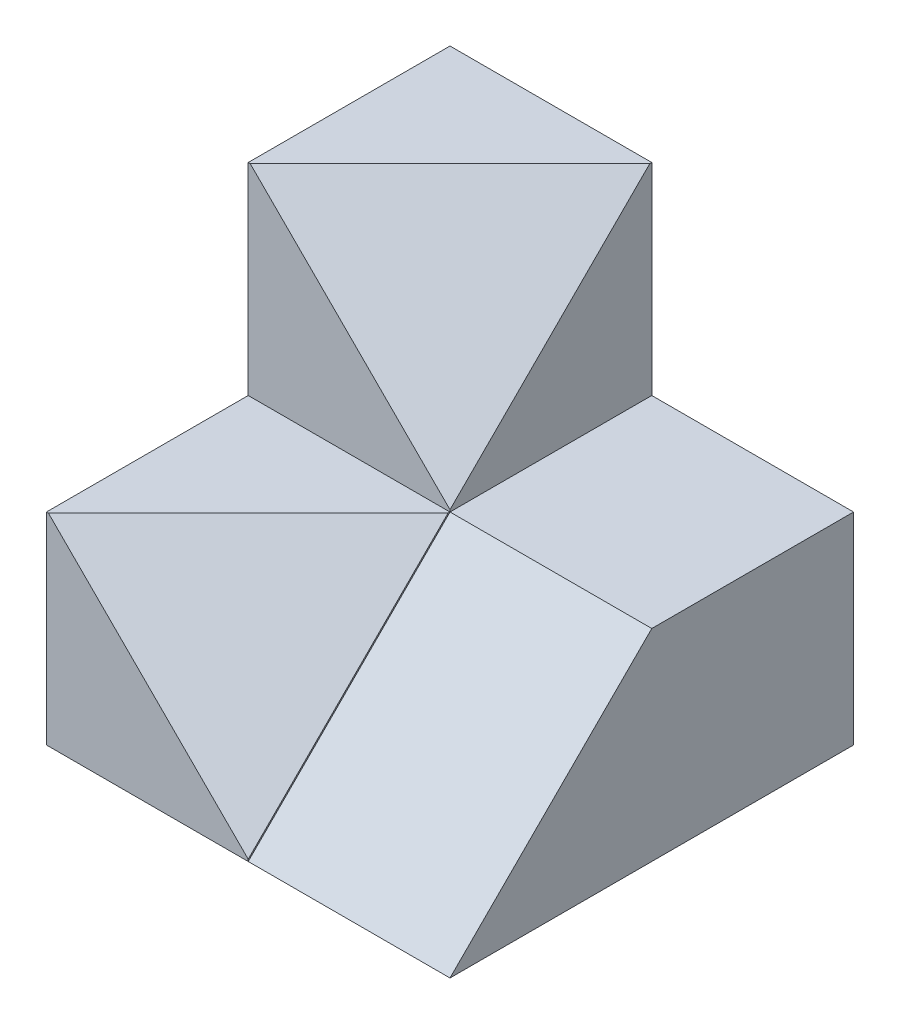
ISO-10303-21;
HEADER;
FILE_DESCRIPTION(('STEP AP214'),'2;1');
FILE_NAME('part.step','',(''),(''),'','','');
FILE_SCHEMA(('AUTOMOTIVE_DESIGN { 1 0 10303 214 1 1 1 1 }'));
ENDSEC;
DATA;
#1=APPLICATION_CONTEXT('core data for automotive mechanical design processes');
#2=APPLICATION_PROTOCOL_DEFINITION('international standard','automotive_design',2000,#1);
#3=PRODUCT_CONTEXT('',#1,'mechanical');
#4=PRODUCT('Part','Part','',(#3));
#5=PRODUCT_RELATED_PRODUCT_CATEGORY('part','',(#4));
#6=PRODUCT_DEFINITION_FORMATION('','',#4);
#7=PRODUCT_DEFINITION_CONTEXT('part definition',#1,'design');
#8=PRODUCT_DEFINITION('design','',#6,#7);
#9=PRODUCT_DEFINITION_SHAPE('','',#8);
#10=(LENGTH_UNIT() NAMED_UNIT(*) SI_UNIT(.MILLI.,.METRE.));
#11=(NAMED_UNIT(*) PLANE_ANGLE_UNIT() SI_UNIT($,.RADIAN.));
#12=(NAMED_UNIT(*) SI_UNIT($,.STERADIAN.) SOLID_ANGLE_UNIT());
#13=UNCERTAINTY_MEASURE_WITH_UNIT(LENGTH_MEASURE(1.E-05),#10,'distance_accuracy_value','');
#14=(GEOMETRIC_REPRESENTATION_CONTEXT(3) GLOBAL_UNCERTAINTY_ASSIGNED_CONTEXT((#13)) GLOBAL_UNIT_ASSIGNED_CONTEXT((#10,
#11,#12)) REPRESENTATION_CONTEXT('',''));
#15=CARTESIAN_POINT('',(0.,0.,0.));
#16=DIRECTION('',(0.,0.,1.));
#17=DIRECTION('',(1.,0.,0.));
#18=AXIS2_PLACEMENT_3D('',#15,#16,#17);
#19=CARTESIAN_POINT('',(0.,20.,0.));
#20=DIRECTION('',(0.,1.,0.));
#21=DIRECTION('',(0.,0.,1.));
#22=AXIS2_PLACEMENT_3D('',#19,#20,#21);
#23=PLANE('',#22);
#24=DIRECTION('',(1.,0.,0.));
#25=VECTOR('',#24,1.);
#26=CARTESIAN_POINT('',(-20.,20.,20.));
#27=LINE('',#26,#25);
#28=CARTESIAN_POINT('',(-20.,20.,20.));
#29=VERTEX_POINT('',#28);
#30=CARTESIAN_POINT('',(-19.8,20.,20.));
#31=VERTEX_POINT('',#30);
#32=EDGE_CURVE('E124',#29,#31,#27,.T.);
#33=ORIENTED_EDGE('',*,*,#32,.T.);
#34=DIRECTION('',(0.707106781186547,0.,-0.707106781186547));
#35=VECTOR('',#34,1.);
#36=CARTESIAN_POINT('',(0.0999999999999968,20.,0.0999999999999968));
#37=LINE('',#36,#35);
#38=CARTESIAN_POINT('',(0.,20.,0.199999999999994));
#39=VERTEX_POINT('',#38);
#40=EDGE_CURVE('E47',#31,#39,#37,.T.);
#41=ORIENTED_EDGE('',*,*,#40,.T.);
#42=DIRECTION('',(0.,0.,1.));
#43=VECTOR('',#42,1.);
#44=CARTESIAN_POINT('',(0.,20.,0.));
#45=LINE('',#44,#43);
#46=CARTESIAN_POINT('',(0.,20.,0.));
#47=VERTEX_POINT('',#46);
#48=EDGE_CURVE('E114',#47,#39,#45,.T.);
#49=ORIENTED_EDGE('',*,*,#48,.F.);
#50=DIRECTION('',(1.,0.,0.));
#51=VECTOR('',#50,1.);
#52=CARTESIAN_POINT('',(-20.,20.,0.));
#53=LINE('',#52,#51);
#54=CARTESIAN_POINT('',(-20.,20.,0.));
#55=VERTEX_POINT('',#54);
#56=EDGE_CURVE('E175',#55,#47,#53,.T.);
#57=ORIENTED_EDGE('',*,*,#56,.F.);
#58=DIRECTION('',(0.,0.,1.));
#59=VECTOR('',#58,1.);
#60=CARTESIAN_POINT('',(-20.,20.,-20.));
#61=LINE('',#60,#59);
#62=EDGE_CURVE('E158',#55,#29,#61,.T.);
#63=ORIENTED_EDGE('',*,*,#62,.T.);
#64=EDGE_LOOP('',(#33,#41,#49,#57,#63));
#65=FACE_BOUND('',#64,.T.);
#66=ADVANCED_FACE('F39',(#65),#23,.T.);
#67=DIRECTION('',(1.,0.,0.));
#68=VECTOR('',#67,1.);
#69=CARTESIAN_POINT('',(0.,20.,0.));
#70=LINE('',#69,#68);
#71=CARTESIAN_POINT('',(20.,20.,0.));
#72=VERTEX_POINT('',#71);
#73=EDGE_CURVE('E178',#47,#72,#70,.T.);
#74=ORIENTED_EDGE('',*,*,#73,.T.);
#75=DIRECTION('',(0.,0.,-1.));
#76=VECTOR('',#75,1.);
#77=CARTESIAN_POINT('',(20.,20.,-20.));
#78=LINE('',#77,#76);
#79=CARTESIAN_POINT('',(20.,20.,-20.));
#80=VERTEX_POINT('',#79);
#81=EDGE_CURVE('E148',#72,#80,#78,.T.);
#82=ORIENTED_EDGE('',*,*,#81,.T.);
#83=DIRECTION('',(-1.,0.,0.));
#84=VECTOR('',#83,1.);
#85=CARTESIAN_POINT('',(-20.,20.,-20.));
#86=LINE('',#85,#84);
#87=CARTESIAN_POINT('',(0.,20.,-20.));
#88=VERTEX_POINT('',#87);
#89=EDGE_CURVE('E160',#80,#88,#86,.T.);
#90=ORIENTED_EDGE('',*,*,#89,.T.);
#91=DIRECTION('',(0.,0.,-1.));
#92=VECTOR('',#91,1.);
#93=CARTESIAN_POINT('',(0.,20.,-20.));
#94=LINE('',#93,#92);
#95=EDGE_CURVE('E171',#47,#88,#94,.T.);
#96=ORIENTED_EDGE('',*,*,#95,.F.);
#97=EDGE_LOOP('',(#74,#82,#90,#96));
#98=FACE_BOUND('',#97,.T.);
#99=ADVANCED_FACE('F219',(#98),#23,.T.);
#100=CARTESIAN_POINT('',(0.,40.,0.));
#101=DIRECTION('',(0.,1.,0.));
#102=DIRECTION('',(0.,0.,1.));
#103=AXIS2_PLACEMENT_3D('',#100,#101,#102);
#104=PLANE('',#103);
#105=DIRECTION('',(1.,0.,0.));
#106=VECTOR('',#105,1.);
#107=CARTESIAN_POINT('',(-20.,40.,0.));
#108=LINE('',#107,#106);
#109=CARTESIAN_POINT('',(-20.,40.,0.));
#110=VERTEX_POINT('',#109);
#111=CARTESIAN_POINT('',(-19.8,40.,0.));
#112=VERTEX_POINT('',#111);
#113=EDGE_CURVE('E183',#110,#112,#108,.T.);
#114=ORIENTED_EDGE('',*,*,#113,.T.);
#115=DIRECTION('',(0.707106781186547,0.,-0.707106781186547));
#116=VECTOR('',#115,1.);
#117=CARTESIAN_POINT('',(-9.9,40.,-9.9));
#118=LINE('',#117,#116);
#119=CARTESIAN_POINT('',(0.,40.,-19.8));
#120=VERTEX_POINT('',#119);
#121=EDGE_CURVE('E127',#112,#120,#118,.T.);
#122=ORIENTED_EDGE('',*,*,#121,.T.);
#123=DIRECTION('',(0.,0.,-1.));
#124=VECTOR('',#123,1.);
#125=CARTESIAN_POINT('',(0.,40.,-20.));
#126=LINE('',#125,#124);
#127=CARTESIAN_POINT('',(0.,40.,-20.));
#128=VERTEX_POINT('',#127);
#129=EDGE_CURVE('E181',#120,#128,#126,.T.);
#130=ORIENTED_EDGE('',*,*,#129,.T.);
#131=DIRECTION('',(-1.,0.,0.));
#132=VECTOR('',#131,1.);
#133=CARTESIAN_POINT('',(-20.,40.,-20.));
#134=LINE('',#133,#132);
#135=CARTESIAN_POINT('',(-20.,40.,-20.));
#136=VERTEX_POINT('',#135);
#137=EDGE_CURVE('E170',#128,#136,#134,.T.);
#138=ORIENTED_EDGE('',*,*,#137,.T.);
#139=DIRECTION('',(0.,0.,1.));
#140=VECTOR('',#139,1.);
#141=CARTESIAN_POINT('',(-20.,40.,-20.));
#142=LINE('',#141,#140);
#143=EDGE_CURVE('E174',#136,#110,#142,.T.);
#144=ORIENTED_EDGE('',*,*,#143,.T.);
#145=EDGE_LOOP('',(#114,#122,#130,#138,#144));
#146=FACE_BOUND('',#145,.T.);
#147=ADVANCED_FACE('F227',(#146),#104,.T.);
#148=CARTESIAN_POINT('',(20.,20.,-20.));
#149=DIRECTION('',(-1.,0.,0.));
#150=DIRECTION('',(0.,0.,1.));
#151=AXIS2_PLACEMENT_3D('',#148,#149,#150);
#152=PLANE('',#151);
#153=ORIENTED_EDGE('',*,*,#81,.F.);
#154=DIRECTION('',(0.,0.707106781186548,-0.707106781186547));
#155=VECTOR('',#154,1.);
#156=CARTESIAN_POINT('',(20.,0.,20.));
#157=LINE('',#156,#155);
#158=CARTESIAN_POINT('',(20.,0.,20.));
#159=VERTEX_POINT('',#158);
#160=EDGE_CURVE('E191',#159,#72,#157,.T.);
#161=ORIENTED_EDGE('',*,*,#160,.F.);
#162=DIRECTION('',(0.,0.,-1.));
#163=VECTOR('',#162,1.);
#164=CARTESIAN_POINT('',(20.,0.,-20.));
#165=LINE('',#164,#163);
#166=CARTESIAN_POINT('',(20.,0.,-20.));
#167=VERTEX_POINT('',#166);
#168=EDGE_CURVE('E153',#159,#167,#165,.T.);
#169=ORIENTED_EDGE('',*,*,#168,.T.);
#170=DIRECTION('',(0.,-1.,0.));
#171=VECTOR('',#170,1.);
#172=CARTESIAN_POINT('',(20.,20.,-20.));
#173=LINE('',#172,#171);
#174=EDGE_CURVE('E136',#80,#167,#173,.T.);
#175=ORIENTED_EDGE('',*,*,#174,.F.);
#176=EDGE_LOOP('',(#153,#161,#169,#175));
#177=FACE_BOUND('',#176,.T.);
#178=ADVANCED_FACE('F41',(#177),#152,.F.);
#179=CARTESIAN_POINT('',(-20.,20.,-20.));
#180=DIRECTION('',(0.,0.,1.));
#181=DIRECTION('',(1.,0.,0.));
#182=AXIS2_PLACEMENT_3D('',#179,#180,#181);
#183=PLANE('',#182);
#184=DIRECTION('',(-1.,0.,0.));
#185=VECTOR('',#184,1.);
#186=CARTESIAN_POINT('',(-20.,0.,-20.));
#187=LINE('',#186,#185);
#188=CARTESIAN_POINT('',(-20.,0.,-20.));
#189=VERTEX_POINT('',#188);
#190=EDGE_CURVE('E151',#167,#189,#187,.T.);
#191=ORIENTED_EDGE('',*,*,#190,.T.);
#192=DIRECTION('',(0.,-1.,0.));
#193=VECTOR('',#192,1.);
#194=CARTESIAN_POINT('',(-20.,20.,-20.));
#195=LINE('',#194,#193);
#196=EDGE_CURVE('E139',#136,#189,#195,.T.);
#197=ORIENTED_EDGE('',*,*,#196,.F.);
#198=ORIENTED_EDGE('',*,*,#137,.F.);
#199=DIRECTION('',(0.,-1.,0.));
#200=VECTOR('',#199,1.);
#201=CARTESIAN_POINT('',(0.,40.,-20.));
#202=LINE('',#201,#200);
#203=EDGE_CURVE('E167',#128,#88,#202,.T.);
#204=ORIENTED_EDGE('',*,*,#203,.T.);
#205=ORIENTED_EDGE('',*,*,#89,.F.);
#206=ORIENTED_EDGE('',*,*,#174,.T.);
#207=EDGE_LOOP('',(#191,#197,#198,#204,#205,#206));
#208=FACE_BOUND('',#207,.T.);
#209=ADVANCED_FACE('F214',(#208),#183,.F.);
#210=CARTESIAN_POINT('',(-20.,20.,-20.));
#211=DIRECTION('',(1.,0.,0.));
#212=DIRECTION('',(0.,0.,-1.));
#213=AXIS2_PLACEMENT_3D('',#210,#211,#212);
#214=PLANE('',#213);
#215=DIRECTION('',(0.,0.,1.));
#216=VECTOR('',#215,1.);
#217=CARTESIAN_POINT('',(-20.,0.,-20.));
#218=LINE('',#217,#216);
#219=CARTESIAN_POINT('',(-20.,0.,20.));
#220=VERTEX_POINT('',#219);
#221=EDGE_CURVE('E149',#189,#220,#218,.T.);
#222=ORIENTED_EDGE('',*,*,#221,.T.);
#223=DIRECTION('',(0.,-1.,0.));
#224=VECTOR('',#223,1.);
#225=CARTESIAN_POINT('',(-20.,20.,20.));
#226=LINE('',#225,#224);
#227=EDGE_CURVE('E142',#29,#220,#226,.T.);
#228=ORIENTED_EDGE('',*,*,#227,.F.);
#229=ORIENTED_EDGE('',*,*,#62,.F.);
#230=DIRECTION('',(0.,-1.,0.));
#231=VECTOR('',#230,1.);
#232=CARTESIAN_POINT('',(-20.,40.,0.));
#233=LINE('',#232,#231);
#234=EDGE_CURVE('E156',#110,#55,#233,.T.);
#235=ORIENTED_EDGE('',*,*,#234,.F.);
#236=ORIENTED_EDGE('',*,*,#143,.F.);
#237=ORIENTED_EDGE('',*,*,#196,.T.);
#238=EDGE_LOOP('',(#222,#228,#229,#235,#236,#237));
#239=FACE_BOUND('',#238,.T.);
#240=ADVANCED_FACE('F208',(#239),#214,.F.);
#241=CARTESIAN_POINT('',(-20.,20.,20.));
#242=DIRECTION('',(0.,0.,-1.));
#243=DIRECTION('',(-1.,0.,0.));
#244=AXIS2_PLACEMENT_3D('',#241,#242,#243);
#245=PLANE('',#244);
#246=DIRECTION('',(0.707106781186548,-0.707106781186548,0.));
#247=VECTOR('',#246,1.);
#248=CARTESIAN_POINT('',(-19.9,20.1,20.));
#249=LINE('',#248,#247);
#250=CARTESIAN_POINT('',(0.,0.200000000000004,20.));
#251=VERTEX_POINT('',#250);
#252=EDGE_CURVE('E54',#31,#251,#249,.T.);
#253=ORIENTED_EDGE('',*,*,#252,.F.);
#254=ORIENTED_EDGE('',*,*,#32,.F.);
#255=ORIENTED_EDGE('',*,*,#227,.T.);
#256=DIRECTION('',(1.,0.,0.));
#257=VECTOR('',#256,1.);
#258=CARTESIAN_POINT('',(-20.,0.,20.));
#259=LINE('',#258,#257);
#260=CARTESIAN_POINT('',(0.,0.,20.));
#261=VERTEX_POINT('',#260);
#262=EDGE_CURVE('E145',#220,#261,#259,.T.);
#263=ORIENTED_EDGE('',*,*,#262,.T.);
#264=DIRECTION('',(0.,-1.,0.));
#265=VECTOR('',#264,1.);
#266=CARTESIAN_POINT('',(0.,20.,20.));
#267=LINE('',#266,#265);
#268=EDGE_CURVE('E192',#251,#261,#267,.T.);
#269=ORIENTED_EDGE('',*,*,#268,.F.);
#270=EDGE_LOOP('',(#253,#254,#255,#263,#269));
#271=FACE_BOUND('',#270,.T.);
#272=ADVANCED_FACE('F204',(#271),#245,.F.);
#273=CARTESIAN_POINT('',(0.,0.,0.));
#274=DIRECTION('',(0.,1.,0.));
#275=DIRECTION('',(0.,0.,1.));
#276=AXIS2_PLACEMENT_3D('',#273,#274,#275);
#277=PLANE('',#276);
#278=ORIENTED_EDGE('',*,*,#168,.F.);
#279=DIRECTION('',(1.,0.,0.));
#280=VECTOR('',#279,1.);
#281=CARTESIAN_POINT('',(0.,0.,20.));
#282=LINE('',#281,#280);
#283=EDGE_CURVE('E121',#261,#159,#282,.T.);
#284=ORIENTED_EDGE('',*,*,#283,.F.);
#285=ORIENTED_EDGE('',*,*,#262,.F.);
#286=ORIENTED_EDGE('',*,*,#221,.F.);
#287=ORIENTED_EDGE('',*,*,#190,.F.);
#288=EDGE_LOOP('',(#278,#284,#285,#286,#287));
#289=FACE_BOUND('',#288,.T.);
#290=ADVANCED_FACE('F202',(#289),#277,.F.);
#291=CARTESIAN_POINT('',(-20.,40.,0.));
#292=DIRECTION('',(0.,0.,-1.));
#293=DIRECTION('',(-1.,0.,0.));
#294=AXIS2_PLACEMENT_3D('',#291,#292,#293);
#295=PLANE('',#294);
#296=DIRECTION('',(0.707106781186548,-0.707106781186548,0.));
#297=VECTOR('',#296,1.);
#298=CARTESIAN_POINT('',(-19.9,40.1,0.));
#299=LINE('',#298,#297);
#300=CARTESIAN_POINT('',(0.,20.2,0.));
#301=VERTEX_POINT('',#300);
#302=EDGE_CURVE('E134',#112,#301,#299,.T.);
#303=ORIENTED_EDGE('',*,*,#302,.F.);
#304=ORIENTED_EDGE('',*,*,#113,.F.);
#305=ORIENTED_EDGE('',*,*,#234,.T.);
#306=ORIENTED_EDGE('',*,*,#56,.T.);
#307=DIRECTION('',(0.,-1.,0.));
#308=VECTOR('',#307,1.);
#309=CARTESIAN_POINT('',(0.,40.,0.));
#310=LINE('',#309,#308);
#311=EDGE_CURVE('E165',#301,#47,#310,.T.);
#312=ORIENTED_EDGE('',*,*,#311,.F.);
#313=EDGE_LOOP('',(#303,#304,#305,#306,#312));
#314=FACE_BOUND('',#313,.T.);
#315=ADVANCED_FACE('F225',(#314),#295,.F.);
#316=CARTESIAN_POINT('',(0.,40.,-20.));
#317=DIRECTION('',(-1.,0.,0.));
#318=DIRECTION('',(0.,0.,1.));
#319=AXIS2_PLACEMENT_3D('',#316,#317,#318);
#320=PLANE('',#319);
#321=DIRECTION('',(0.,0.707106781186548,-0.707106781186548));
#322=VECTOR('',#321,1.);
#323=CARTESIAN_POINT('',(0.,40.1,-19.9));
#324=LINE('',#323,#322);
#325=EDGE_CURVE('E130',#301,#120,#324,.T.);
#326=ORIENTED_EDGE('',*,*,#325,.F.);
#327=ORIENTED_EDGE('',*,*,#311,.T.);
#328=ORIENTED_EDGE('',*,*,#95,.T.);
#329=ORIENTED_EDGE('',*,*,#203,.F.);
#330=ORIENTED_EDGE('',*,*,#129,.F.);
#331=EDGE_LOOP('',(#326,#327,#328,#329,#330));
#332=FACE_BOUND('',#331,.T.);
#333=ADVANCED_FACE('F231',(#332),#320,.F.);
#334=CARTESIAN_POINT('',(6.73333333333334,6.73333333333334,6.73333333333334));
#335=DIRECTION('',(0.577350269189626,0.577350269189626,0.577350269189626));
#336=DIRECTION('',(0.707106781186547,0.,-0.707106781186547));
#337=AXIS2_PLACEMENT_3D('',#334,#335,#336);
#338=PLANE('',#337);
#339=ORIENTED_EDGE('',*,*,#121,.F.);
#340=ORIENTED_EDGE('',*,*,#302,.T.);
#341=ORIENTED_EDGE('',*,*,#325,.T.);
#342=EDGE_LOOP('',(#339,#340,#341));
#343=FACE_BOUND('',#342,.T.);
#344=ADVANCED_FACE('F233',(#343),#338,.T.);
#345=CARTESIAN_POINT('',(0.,0.,20.));
#346=DIRECTION('',(0.,-0.707106781186548,-0.707106781186548));
#347=DIRECTION('',(0.,0.707106781186548,-0.707106781186547));
#348=AXIS2_PLACEMENT_3D('',#345,#346,#347);
#349=PLANE('',#348);
#350=ORIENTED_EDGE('',*,*,#160,.T.);
#351=ORIENTED_EDGE('',*,*,#73,.F.);
#352=DIRECTION('',(0.,0.707106781186548,-0.707106781186547));
#353=VECTOR('',#352,1.);
#354=CARTESIAN_POINT('',(0.,0.,20.));
#355=LINE('',#354,#353);
#356=EDGE_CURVE('E118',#261,#47,#355,.T.);
#357=ORIENTED_EDGE('',*,*,#356,.F.);
#358=ORIENTED_EDGE('',*,*,#283,.T.);
#359=EDGE_LOOP('',(#350,#351,#357,#358));
#360=FACE_BOUND('',#359,.T.);
#361=ADVANCED_FACE('F197',(#360),#349,.F.);
#362=CARTESIAN_POINT('',(0.,0.,0.));
#363=DIRECTION('',(-1.,0.,0.));
#364=DIRECTION('',(0.,0.,1.));
#365=AXIS2_PLACEMENT_3D('',#362,#363,#364);
#366=PLANE('',#365);
#367=DIRECTION('',(0.,0.707106781186547,-0.707106781186547));
#368=VECTOR('',#367,1.);
#369=CARTESIAN_POINT('',(0.,10.1,10.1));
#370=LINE('',#369,#368);
#371=EDGE_CURVE('E11',#251,#39,#370,.T.);
#372=ORIENTED_EDGE('',*,*,#371,.F.);
#373=ORIENTED_EDGE('',*,*,#268,.T.);
#374=ORIENTED_EDGE('',*,*,#356,.T.);
#375=ORIENTED_EDGE('',*,*,#48,.T.);
#376=EDGE_LOOP('',(#372,#373,#374,#375));
#377=FACE_BOUND('',#376,.T.);
#378=ADVANCED_FACE('F116',(#377),#366,.F.);
#379=CARTESIAN_POINT('',(6.73333333333333,6.73333333333333,6.73333333333333));
#380=DIRECTION('',(0.577350269189626,0.577350269189626,0.577350269189626));
#381=DIRECTION('',(0.707106781186547,0.,-0.707106781186547));
#382=AXIS2_PLACEMENT_3D('',#379,#380,#381);
#383=PLANE('',#382);
#384=ORIENTED_EDGE('',*,*,#40,.F.);
#385=ORIENTED_EDGE('',*,*,#252,.T.);
#386=ORIENTED_EDGE('',*,*,#371,.T.);
#387=EDGE_LOOP('',(#384,#385,#386));
#388=FACE_BOUND('',#387,.T.);
#389=ADVANCED_FACE('F126',(#388),#383,.T.);
#390=CLOSED_SHELL('',(#66,#99,#147,#178,#209,#240,#272,#290,#315,#333,#344,#361,#378,#389));
#391=MANIFOLD_SOLID_BREP('B2',#390);
#392=ADVANCED_BREP_SHAPE_REPRESENTATION('',(#18,#391),#14);
#393=SHAPE_DEFINITION_REPRESENTATION(#9,#392);
ENDSEC;
END-ISO-10303-21;
